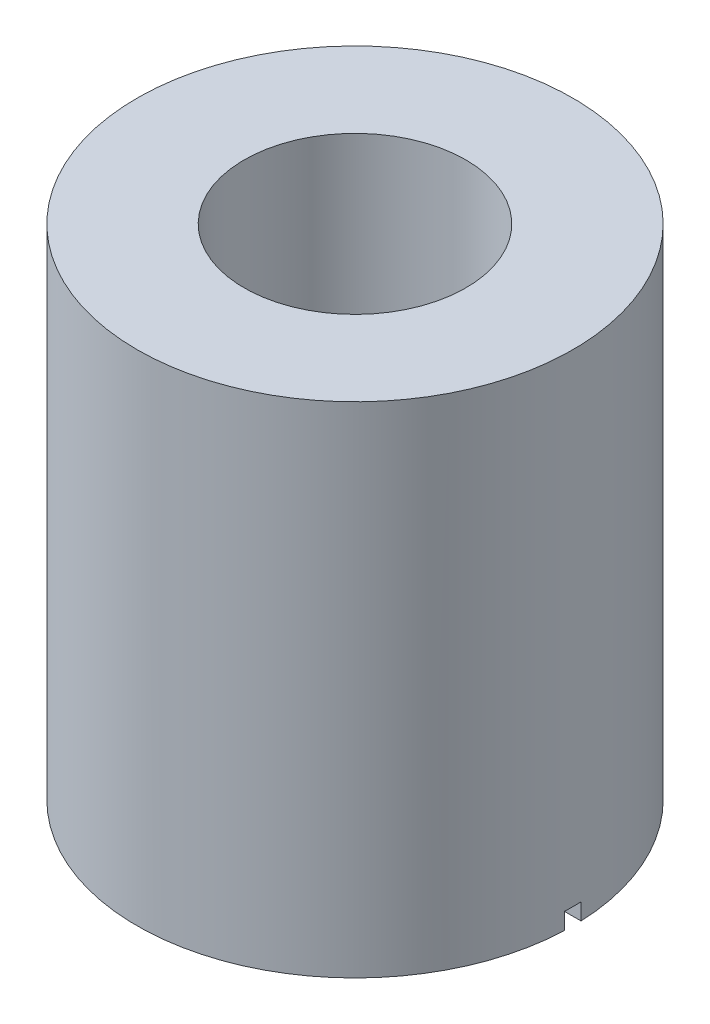
ISO-10303-21;
HEADER;
FILE_DESCRIPTION(('STEP AP214'),'2;1');
FILE_NAME('part.step','',(''),(''),'','','');
FILE_SCHEMA(('AUTOMOTIVE_DESIGN { 1 0 10303 214 1 1 1 1 }'));
ENDSEC;
DATA;
#1=APPLICATION_CONTEXT('core data for automotive mechanical design processes');
#2=APPLICATION_PROTOCOL_DEFINITION('international standard','automotive_design',2000,#1);
#3=PRODUCT_CONTEXT('',#1,'mechanical');
#4=PRODUCT('Part','Part','',(#3));
#5=PRODUCT_RELATED_PRODUCT_CATEGORY('part','',(#4));
#6=PRODUCT_DEFINITION_FORMATION('','',#4);
#7=PRODUCT_DEFINITION_CONTEXT('part definition',#1,'design');
#8=PRODUCT_DEFINITION('design','',#6,#7);
#9=PRODUCT_DEFINITION_SHAPE('','',#8);
#10=(LENGTH_UNIT() NAMED_UNIT(*) SI_UNIT(.MILLI.,.METRE.));
#11=(NAMED_UNIT(*) PLANE_ANGLE_UNIT() SI_UNIT($,.RADIAN.));
#12=(NAMED_UNIT(*) SI_UNIT($,.STERADIAN.) SOLID_ANGLE_UNIT());
#13=UNCERTAINTY_MEASURE_WITH_UNIT(LENGTH_MEASURE(1.E-05),#10,'distance_accuracy_value','');
#14=(GEOMETRIC_REPRESENTATION_CONTEXT(3) GLOBAL_UNCERTAINTY_ASSIGNED_CONTEXT((#13)) GLOBAL_UNIT_ASSIGNED_CONTEXT((#10,
#11,#12)) REPRESENTATION_CONTEXT('',''));
#15=CARTESIAN_POINT('',(0.,0.,0.));
#16=DIRECTION('',(0.,0.,1.));
#17=DIRECTION('',(1.,0.,0.));
#18=AXIS2_PLACEMENT_3D('',#15,#16,#17);
#19=CARTESIAN_POINT('',(0.,0.,0.));
#20=DIRECTION('',(0.,1.,0.));
#21=DIRECTION('',(0.,0.,1.));
#22=AXIS2_PLACEMENT_3D('',#19,#20,#21);
#23=PLANE('',#22);
#24=CARTESIAN_POINT('',(0.,0.,0.));
#25=DIRECTION('',(0.,1.,0.));
#26=DIRECTION('',(0.,0.,1.));
#27=AXIS2_PLACEMENT_3D('',#24,#25,#26);
#28=CIRCLE('',#27,19.65);
#29=CARTESIAN_POINT('',(-19.6356818063443,0.,0.75));
#30=VERTEX_POINT('',#29);
#31=CARTESIAN_POINT('',(19.6356818063443,0.,0.75));
#32=VERTEX_POINT('',#31);
#33=EDGE_CURVE('E128',#30,#32,#28,.T.);
#34=ORIENTED_EDGE('',*,*,#33,.F.);
#35=DIRECTION('',(-1.,0.,0.));
#36=VECTOR('',#35,1.);
#37=CARTESIAN_POINT('',(63.5,0.,0.75));
#38=LINE('',#37,#36);
#39=CARTESIAN_POINT('',(-15.9824122084246,0.,0.75));
#40=VERTEX_POINT('',#39);
#41=EDGE_CURVE('E216',#40,#30,#38,.T.);
#42=ORIENTED_EDGE('',*,*,#41,.F.);
#43=CARTESIAN_POINT('',(0.,0.,0.));
#44=DIRECTION('',(0.,-1.,0.));
#45=DIRECTION('',(0.,0.,-1.));
#46=AXIS2_PLACEMENT_3D('',#43,#44,#45);
#47=CIRCLE('',#46,16.);
#48=CARTESIAN_POINT('',(15.9824122084246,0.,0.75));
#49=VERTEX_POINT('',#48);
#50=EDGE_CURVE('E145',#49,#40,#47,.T.);
#51=ORIENTED_EDGE('',*,*,#50,.F.);
#52=EDGE_CURVE('E200',#32,#49,#38,.T.);
#53=ORIENTED_EDGE('',*,*,#52,.F.);
#54=EDGE_LOOP('',(#34,#42,#51,#53));
#55=FACE_BOUND('',#54,.T.);
#56=ADVANCED_FACE('F38',(#55),#23,.F.);
#57=CARTESIAN_POINT('',(0.,18.,0.));
#58=DIRECTION('',(0.,-1.,0.));
#59=DIRECTION('',(0.,0.,-1.));
#60=AXIS2_PLACEMENT_3D('',#57,#58,#59);
#61=CYLINDRICAL_SURFACE('',#60,0.5);
#62=CARTESIAN_POINT('',(0.,18.,0.));
#63=DIRECTION('',(0.,-1.,0.));
#64=DIRECTION('',(0.,0.,-1.));
#65=AXIS2_PLACEMENT_3D('',#62,#63,#64);
#66=CIRCLE('',#65,0.5);
#67=CARTESIAN_POINT('',(0.,18.,-0.5));
#68=VERTEX_POINT('',#67);
#69=EDGE_CURVE('E149',#68,#68,#66,.T.);
#70=ORIENTED_EDGE('',*,*,#69,.F.);
#71=EDGE_LOOP('',(#70));
#72=FACE_BOUND('',#71,.T.);
#73=CARTESIAN_POINT('',(0.,5.,0.));
#74=DIRECTION('',(0.,-1.,0.));
#75=DIRECTION('',(0.,0.,-1.));
#76=AXIS2_PLACEMENT_3D('',#73,#74,#75);
#77=CIRCLE('',#76,0.5);
#78=CARTESIAN_POINT('',(0.,5.,-0.5));
#79=VERTEX_POINT('',#78);
#80=EDGE_CURVE('E144',#79,#79,#77,.F.);
#81=ORIENTED_EDGE('',*,*,#80,.F.);
#82=EDGE_LOOP('',(#81));
#83=FACE_BOUND('',#82,.T.);
#84=ADVANCED_FACE('F225',(#72,#83),#61,.F.);
#85=CARTESIAN_POINT('',(0.,45.,0.));
#86=DIRECTION('',(0.,-1.,0.));
#87=DIRECTION('',(0.,0.,-1.));
#88=AXIS2_PLACEMENT_3D('',#85,#86,#87);
#89=CYLINDRICAL_SURFACE('',#88,10.);
#90=CARTESIAN_POINT('',(0.,45.,0.));
#91=DIRECTION('',(0.,1.,0.));
#92=DIRECTION('',(0.,0.,1.));
#93=AXIS2_PLACEMENT_3D('',#90,#91,#92);
#94=CIRCLE('',#93,10.);
#95=CARTESIAN_POINT('',(0.,45.,-10.));
#96=VERTEX_POINT('',#95);
#97=EDGE_CURVE('E157',#96,#96,#94,.T.);
#98=CARTESIAN_POINT('',(0.,18.,0.));
#99=DIRECTION('',(0.,-1.,0.));
#100=DIRECTION('',(0.,0.,-1.));
#101=AXIS2_PLACEMENT_3D('',#98,#99,#100);
#102=CIRCLE('',#101,10.);
#103=CARTESIAN_POINT('',(0.,18.,-10.));
#104=VERTEX_POINT('',#103);
#105=EDGE_CURVE('E153',#104,#104,#102,.T.);
#106=CARTESIAN_POINT('',(0.,45.,-10.));
#107=CARTESIAN_POINT('',(0.,44.71875,-10.));
#108=CARTESIAN_POINT('',(0.,44.4375,-10.));
#109=CARTESIAN_POINT('',(0.,43.875,-10.));
#110=CARTESIAN_POINT('',(0.,43.59375,-10.));
#111=CARTESIAN_POINT('',(0.,43.03125,-10.));
#112=CARTESIAN_POINT('',(0.,42.75,-10.));
#113=CARTESIAN_POINT('',(0.,42.1875,-10.));
#114=CARTESIAN_POINT('',(0.,41.90625,-10.));
#115=CARTESIAN_POINT('',(0.,41.34375,-10.));
#116=CARTESIAN_POINT('',(0.,41.0625,-10.));
#117=CARTESIAN_POINT('',(0.,40.5,-10.));
#118=CARTESIAN_POINT('',(0.,40.21875,-10.));
#119=CARTESIAN_POINT('',(0.,39.65625,-10.));
#120=CARTESIAN_POINT('',(0.,39.375,-10.));
#121=CARTESIAN_POINT('',(0.,38.8125,-10.));
#122=CARTESIAN_POINT('',(0.,38.53125,-10.));
#123=CARTESIAN_POINT('',(0.,37.96875,-10.));
#124=CARTESIAN_POINT('',(0.,37.6875,-10.));
#125=CARTESIAN_POINT('',(0.,37.125,-10.));
#126=CARTESIAN_POINT('',(0.,36.84375,-10.));
#127=CARTESIAN_POINT('',(0.,36.28125,-10.));
#128=CARTESIAN_POINT('',(0.,36.,-10.));
#129=CARTESIAN_POINT('',(0.,35.4375,-10.));
#130=CARTESIAN_POINT('',(0.,35.15625,-10.));
#131=CARTESIAN_POINT('',(0.,34.59375,-10.));
#132=CARTESIAN_POINT('',(0.,34.3125,-10.));
#133=CARTESIAN_POINT('',(0.,33.75,-10.));
#134=CARTESIAN_POINT('',(0.,33.46875,-10.));
#135=CARTESIAN_POINT('',(0.,32.90625,-10.));
#136=CARTESIAN_POINT('',(0.,32.625,-10.));
#137=CARTESIAN_POINT('',(0.,32.0625,-10.));
#138=CARTESIAN_POINT('',(0.,31.78125,-10.));
#139=CARTESIAN_POINT('',(0.,31.21875,-10.));
#140=CARTESIAN_POINT('',(0.,30.9375,-10.));
#141=CARTESIAN_POINT('',(0.,30.375,-10.));
#142=CARTESIAN_POINT('',(0.,30.09375,-10.));
#143=CARTESIAN_POINT('',(0.,29.53125,-10.));
#144=CARTESIAN_POINT('',(0.,29.25,-10.));
#145=CARTESIAN_POINT('',(0.,28.6875,-10.));
#146=CARTESIAN_POINT('',(0.,28.40625,-10.));
#147=CARTESIAN_POINT('',(0.,27.84375,-10.));
#148=CARTESIAN_POINT('',(0.,27.5625,-10.));
#149=CARTESIAN_POINT('',(0.,27.,-10.));
#150=CARTESIAN_POINT('',(0.,26.71875,-10.));
#151=CARTESIAN_POINT('',(0.,26.15625,-10.));
#152=CARTESIAN_POINT('',(0.,25.875,-10.));
#153=CARTESIAN_POINT('',(0.,25.3125,-10.));
#154=CARTESIAN_POINT('',(0.,25.03125,-10.));
#155=CARTESIAN_POINT('',(0.,24.46875,-10.));
#156=CARTESIAN_POINT('',(0.,24.1875,-10.));
#157=CARTESIAN_POINT('',(0.,23.625,-10.));
#158=CARTESIAN_POINT('',(0.,23.34375,-10.));
#159=CARTESIAN_POINT('',(0.,22.78125,-10.));
#160=CARTESIAN_POINT('',(0.,22.5,-10.));
#161=CARTESIAN_POINT('',(0.,21.9375,-10.));
#162=CARTESIAN_POINT('',(0.,21.65625,-10.));
#163=CARTESIAN_POINT('',(0.,21.09375,-10.));
#164=CARTESIAN_POINT('',(0.,20.8125,-10.));
#165=CARTESIAN_POINT('',(0.,20.25,-10.));
#166=CARTESIAN_POINT('',(0.,19.96875,-10.));
#167=CARTESIAN_POINT('',(0.,19.40625,-10.));
#168=CARTESIAN_POINT('',(0.,19.125,-10.));
#169=CARTESIAN_POINT('',(0.,18.5625,-10.));
#170=CARTESIAN_POINT('',(0.,18.28125,-10.));
#171=CARTESIAN_POINT('',(0.,18.,-10.));
#172=B_SPLINE_CURVE_WITH_KNOTS('',3,(#106,#107,#108,#109,#110,#111,#112,#113,#114,#115,#116,
#117,#118,#119,#120,#121,#122,#123,#124,#125,#126,#127,#128,#129,#130,#131,#132,#133,#134,#135,
#136,#137,#138,#139,#140,#141,#142,#143,#144,#145,#146,#147,#148,#149,#150,#151,#152,#153,#154,
#155,#156,#157,#158,#159,#160,#161,#162,#163,#164,#165,#166,#167,#168,#169,#170,#171),
.UNSPECIFIED.,.F.,.F.,(4,2,2,2,2,2,2,2,2,2,2,2,2,2,2,2,2,2,2,2,2,2,2,2,2,2,2,2,2,2,2,2,4),(0.,
0.843749999999997,1.68749999999999,2.53125,3.375,4.21874999999999,5.0625,5.90624999999999,6.75,
7.59375,8.43749999999999,9.28125,10.125,10.96875,11.8125,12.65625,13.5,14.34375,15.1875,
16.03125,16.875,17.71875,18.5625,19.40625,20.25,21.09375,21.9375,22.78125,23.625,24.46875,
25.3125,26.15625,27.),.UNSPECIFIED.);
#173=EDGE_CURVE('BSEAM229',#96,#104,#172,.T.);
#174=ORIENTED_EDGE('',*,*,#97,.T.);
#175=ORIENTED_EDGE('',*,*,#105,.T.);
#176=ORIENTED_EDGE('',*,*,#173,.T.);
#177=ORIENTED_EDGE('',*,*,#173,.F.);
#178=EDGE_LOOP('',(#174,#176,#175,#177));
#179=FACE_BOUND('',#178,.T.);
#180=ADVANCED_FACE('F229',(#179),#89,.F.);
#181=CARTESIAN_POINT('',(0.,45.,0.));
#182=DIRECTION('',(0.,1.,0.));
#183=DIRECTION('',(0.,0.,1.));
#184=AXIS2_PLACEMENT_3D('',#181,#182,#183);
#185=PLANE('',#184);
#186=CARTESIAN_POINT('',(0.,45.,0.));
#187=DIRECTION('',(0.,1.,0.));
#188=DIRECTION('',(0.,0.,1.));
#189=AXIS2_PLACEMENT_3D('',#186,#187,#188);
#190=CIRCLE('',#189,19.65);
#191=CARTESIAN_POINT('',(0.,45.,19.65));
#192=VERTEX_POINT('',#191);
#193=EDGE_CURVE('E161',#192,#192,#190,.T.);
#194=ORIENTED_EDGE('',*,*,#193,.T.);
#195=EDGE_LOOP('',(#194));
#196=FACE_BOUND('',#195,.T.);
#197=ORIENTED_EDGE('',*,*,#97,.F.);
#198=EDGE_LOOP('',(#197));
#199=FACE_BOUND('',#198,.T.);
#200=ADVANCED_FACE('F234',(#196,#199),#185,.T.);
#201=CARTESIAN_POINT('',(19.6356818063443,0.,-0.75));
#202=VERTEX_POINT('',#201);
#203=CARTESIAN_POINT('',(-19.6356818063443,0.,-0.75));
#204=VERTEX_POINT('',#203);
#205=EDGE_CURVE('E166',#202,#204,#28,.T.);
#206=ORIENTED_EDGE('',*,*,#205,.F.);
#207=DIRECTION('',(-1.,0.,0.));
#208=VECTOR('',#207,1.);
#209=CARTESIAN_POINT('',(63.5,0.,-0.75));
#210=LINE('',#209,#208);
#211=CARTESIAN_POINT('',(15.9824122084246,0.,-0.75));
#212=VERTEX_POINT('',#211);
#213=EDGE_CURVE('E213',#202,#212,#210,.T.);
#214=ORIENTED_EDGE('',*,*,#213,.T.);
#215=CARTESIAN_POINT('',(-15.9824122084246,0.,-0.75));
#216=VERTEX_POINT('',#215);
#217=EDGE_CURVE('E135',#216,#212,#47,.T.);
#218=ORIENTED_EDGE('',*,*,#217,.F.);
#219=EDGE_CURVE('E208',#216,#204,#210,.T.);
#220=ORIENTED_EDGE('',*,*,#219,.T.);
#221=EDGE_LOOP('',(#206,#214,#218,#220));
#222=FACE_BOUND('',#221,.T.);
#223=ADVANCED_FACE('F210',(#222),#23,.F.);
#224=CARTESIAN_POINT('',(0.,45.,0.));
#225=DIRECTION('',(0.,-1.,0.));
#226=DIRECTION('',(0.,0.,-1.));
#227=AXIS2_PLACEMENT_3D('',#224,#225,#226);
#228=CYLINDRICAL_SURFACE('',#227,19.65);
#229=ORIENTED_EDGE('',*,*,#33,.T.);
#230=DIRECTION('',(0.,-1.,0.));
#231=VECTOR('',#230,1.);
#232=CARTESIAN_POINT('',(19.6356818063443,45.,0.75));
#233=LINE('',#232,#231);
#234=CARTESIAN_POINT('',(19.6356818063443,1.5,0.75));
#235=VERTEX_POINT('',#234);
#236=EDGE_CURVE('E116',#32,#235,#233,.F.);
#237=ORIENTED_EDGE('',*,*,#236,.T.);
#238=CARTESIAN_POINT('',(0.,1.5,0.));
#239=DIRECTION('',(0.,1.,0.));
#240=DIRECTION('',(0.,0.,1.));
#241=AXIS2_PLACEMENT_3D('',#238,#239,#240);
#242=CIRCLE('',#241,19.65);
#243=CARTESIAN_POINT('',(19.6356818063443,1.5,-0.75));
#244=VERTEX_POINT('',#243);
#245=EDGE_CURVE('E103',#235,#244,#242,.T.);
#246=ORIENTED_EDGE('',*,*,#245,.T.);
#247=DIRECTION('',(0.,-1.,0.));
#248=VECTOR('',#247,1.);
#249=CARTESIAN_POINT('',(19.6356818063443,45.,-0.75));
#250=LINE('',#249,#248);
#251=EDGE_CURVE('E131',#244,#202,#250,.T.);
#252=ORIENTED_EDGE('',*,*,#251,.T.);
#253=ORIENTED_EDGE('',*,*,#205,.T.);
#254=DIRECTION('',(0.,-1.,0.));
#255=VECTOR('',#254,1.);
#256=CARTESIAN_POINT('',(-19.6356818063443,45.,-0.75));
#257=LINE('',#256,#255);
#258=CARTESIAN_POINT('',(-19.6356818063443,1.5,-0.75));
#259=VERTEX_POINT('',#258);
#260=EDGE_CURVE('E111',#204,#259,#257,.F.);
#261=ORIENTED_EDGE('',*,*,#260,.T.);
#262=CARTESIAN_POINT('',(-19.6356818063443,1.5,0.75));
#263=VERTEX_POINT('',#262);
#264=EDGE_CURVE('E112',#259,#263,#242,.T.);
#265=ORIENTED_EDGE('',*,*,#264,.T.);
#266=DIRECTION('',(0.,-1.,0.));
#267=VECTOR('',#266,1.);
#268=CARTESIAN_POINT('',(-19.6356818063443,45.,0.75));
#269=LINE('',#268,#267);
#270=EDGE_CURVE('E130',#263,#30,#269,.T.);
#271=ORIENTED_EDGE('',*,*,#270,.T.);
#272=EDGE_LOOP('',(#229,#237,#246,#252,#253,#261,#265,#271));
#273=FACE_BOUND('',#272,.T.);
#274=ORIENTED_EDGE('',*,*,#193,.F.);
#275=EDGE_LOOP('',(#274));
#276=FACE_BOUND('',#275,.T.);
#277=ADVANCED_FACE('F40',(#273,#276),#228,.T.);
#278=CARTESIAN_POINT('',(0.,18.,0.));
#279=DIRECTION('',(0.,-1.,0.));
#280=DIRECTION('',(0.,0.,-1.));
#281=AXIS2_PLACEMENT_3D('',#278,#279,#280);
#282=PLANE('',#281);
#283=ORIENTED_EDGE('',*,*,#69,.T.);
#284=EDGE_LOOP('',(#283));
#285=FACE_BOUND('',#284,.T.);
#286=ORIENTED_EDGE('',*,*,#105,.F.);
#287=EDGE_LOOP('',(#286));
#288=FACE_BOUND('',#287,.T.);
#289=ADVANCED_FACE('F239',(#285,#288),#282,.F.);
#290=CARTESIAN_POINT('',(0.,5.,0.));
#291=DIRECTION('',(0.,-1.,0.));
#292=DIRECTION('',(0.,0.,-1.));
#293=AXIS2_PLACEMENT_3D('',#290,#291,#292);
#294=PLANE('',#293);
#295=CARTESIAN_POINT('',(0.,5.,0.));
#296=DIRECTION('',(0.,-1.,0.));
#297=DIRECTION('',(0.,0.,-1.));
#298=AXIS2_PLACEMENT_3D('',#295,#296,#297);
#299=CIRCLE('',#298,16.);
#300=CARTESIAN_POINT('',(0.,5.,-16.));
#301=VERTEX_POINT('',#300);
#302=EDGE_CURVE('E140',#301,#301,#299,.T.);
#303=ORIENTED_EDGE('',*,*,#302,.T.);
#304=EDGE_LOOP('',(#303));
#305=FACE_BOUND('',#304,.T.);
#306=ORIENTED_EDGE('',*,*,#80,.T.);
#307=EDGE_LOOP('',(#306));
#308=FACE_BOUND('',#307,.T.);
#309=ADVANCED_FACE('F249',(#305,#308),#294,.T.);
#310=CARTESIAN_POINT('',(0.,5.,0.));
#311=DIRECTION('',(0.,-1.,0.));
#312=DIRECTION('',(0.,0.,-1.));
#313=AXIS2_PLACEMENT_3D('',#310,#311,#312);
#314=CYLINDRICAL_SURFACE('',#313,16.);
#315=ORIENTED_EDGE('',*,*,#50,.T.);
#316=DIRECTION('',(0.,-1.,0.));
#317=VECTOR('',#316,1.);
#318=CARTESIAN_POINT('',(-15.9824122084246,5.,0.75));
#319=LINE('',#318,#317);
#320=CARTESIAN_POINT('',(-15.9824122084246,1.5,0.75));
#321=VERTEX_POINT('',#320);
#322=EDGE_CURVE('E11',#40,#321,#319,.F.);
#323=ORIENTED_EDGE('',*,*,#322,.T.);
#324=CARTESIAN_POINT('',(0.,1.5,0.));
#325=DIRECTION('',(0.,1.,0.));
#326=DIRECTION('',(0.,0.,1.));
#327=AXIS2_PLACEMENT_3D('',#324,#325,#326);
#328=CIRCLE('',#327,16.);
#329=CARTESIAN_POINT('',(-15.9824122084246,1.5,-0.75));
#330=VERTEX_POINT('',#329);
#331=EDGE_CURVE('E175',#321,#330,#328,.F.);
#332=ORIENTED_EDGE('',*,*,#331,.T.);
#333=DIRECTION('',(0.,-1.,0.));
#334=VECTOR('',#333,1.);
#335=CARTESIAN_POINT('',(-15.9824122084246,5.,-0.75));
#336=LINE('',#335,#334);
#337=EDGE_CURVE('E47',#330,#216,#336,.T.);
#338=ORIENTED_EDGE('',*,*,#337,.T.);
#339=ORIENTED_EDGE('',*,*,#217,.T.);
#340=DIRECTION('',(0.,-1.,0.));
#341=VECTOR('',#340,1.);
#342=CARTESIAN_POINT('',(15.9824122084246,5.,-0.75));
#343=LINE('',#342,#341);
#344=CARTESIAN_POINT('',(15.9824122084246,1.5,-0.75));
#345=VERTEX_POINT('',#344);
#346=EDGE_CURVE('E174',#212,#345,#343,.F.);
#347=ORIENTED_EDGE('',*,*,#346,.T.);
#348=CARTESIAN_POINT('',(15.9824122084246,1.5,0.75));
#349=VERTEX_POINT('',#348);
#350=EDGE_CURVE('E165',#345,#349,#328,.F.);
#351=ORIENTED_EDGE('',*,*,#350,.T.);
#352=DIRECTION('',(0.,-1.,0.));
#353=VECTOR('',#352,1.);
#354=CARTESIAN_POINT('',(15.9824122084246,5.,0.75));
#355=LINE('',#354,#353);
#356=EDGE_CURVE('E119',#349,#49,#355,.T.);
#357=ORIENTED_EDGE('',*,*,#356,.T.);
#358=EDGE_LOOP('',(#315,#323,#332,#338,#339,#347,#351,#357));
#359=FACE_BOUND('',#358,.T.);
#360=ORIENTED_EDGE('',*,*,#302,.F.);
#361=EDGE_LOOP('',(#360));
#362=FACE_BOUND('',#361,.T.);
#363=ADVANCED_FACE('F187',(#359,#362),#314,.F.);
#364=CARTESIAN_POINT('',(63.5,1.5,0.75));
#365=DIRECTION('',(0.,1.,0.));
#366=DIRECTION('',(0.,0.,1.));
#367=AXIS2_PLACEMENT_3D('',#364,#365,#366);
#368=PLANE('',#367);
#369=DIRECTION('',(-1.,0.,0.));
#370=VECTOR('',#369,1.);
#371=CARTESIAN_POINT('',(63.5,1.5,0.75));
#372=LINE('',#371,#370);
#373=EDGE_CURVE('E62',#235,#349,#372,.T.);
#374=ORIENTED_EDGE('',*,*,#373,.T.);
#375=ORIENTED_EDGE('',*,*,#350,.F.);
#376=DIRECTION('',(-1.,0.,0.));
#377=VECTOR('',#376,1.);
#378=CARTESIAN_POINT('',(63.5,1.5,-0.75));
#379=LINE('',#378,#377);
#380=EDGE_CURVE('E106',#244,#345,#379,.T.);
#381=ORIENTED_EDGE('',*,*,#380,.F.);
#382=ORIENTED_EDGE('',*,*,#245,.F.);
#383=EDGE_LOOP('',(#374,#375,#381,#382));
#384=FACE_BOUND('',#383,.T.);
#385=ADVANCED_FACE('F104',(#384),#368,.F.);
#386=CARTESIAN_POINT('',(63.5,1.5,-0.75));
#387=DIRECTION('',(0.,0.,-1.));
#388=DIRECTION('',(-1.,0.,0.));
#389=AXIS2_PLACEMENT_3D('',#386,#387,#388);
#390=PLANE('',#389);
#391=ORIENTED_EDGE('',*,*,#380,.T.);
#392=ORIENTED_EDGE('',*,*,#346,.F.);
#393=ORIENTED_EDGE('',*,*,#213,.F.);
#394=ORIENTED_EDGE('',*,*,#251,.F.);
#395=EDGE_LOOP('',(#391,#392,#393,#394));
#396=FACE_BOUND('',#395,.T.);
#397=ADVANCED_FACE('F261',(#396),#390,.F.);
#398=CARTESIAN_POINT('',(63.5,1.5,0.75));
#399=DIRECTION('',(0.,0.,1.));
#400=DIRECTION('',(1.,0.,0.));
#401=AXIS2_PLACEMENT_3D('',#398,#399,#400);
#402=PLANE('',#401);
#403=ORIENTED_EDGE('',*,*,#52,.T.);
#404=ORIENTED_EDGE('',*,*,#356,.F.);
#405=ORIENTED_EDGE('',*,*,#373,.F.);
#406=ORIENTED_EDGE('',*,*,#236,.F.);
#407=EDGE_LOOP('',(#403,#404,#405,#406));
#408=FACE_BOUND('',#407,.T.);
#409=ADVANCED_FACE('F115',(#408),#402,.F.);
#410=EDGE_CURVE('E122',#321,#263,#372,.T.);
#411=ORIENTED_EDGE('',*,*,#410,.F.);
#412=ORIENTED_EDGE('',*,*,#322,.F.);
#413=ORIENTED_EDGE('',*,*,#41,.T.);
#414=ORIENTED_EDGE('',*,*,#270,.F.);
#415=EDGE_LOOP('',(#411,#412,#413,#414));
#416=FACE_BOUND('',#415,.T.);
#417=ADVANCED_FACE('F194',(#416),#402,.F.);
#418=ORIENTED_EDGE('',*,*,#219,.F.);
#419=ORIENTED_EDGE('',*,*,#337,.F.);
#420=EDGE_CURVE('E54',#330,#259,#379,.T.);
#421=ORIENTED_EDGE('',*,*,#420,.T.);
#422=ORIENTED_EDGE('',*,*,#260,.F.);
#423=EDGE_LOOP('',(#418,#419,#421,#422));
#424=FACE_BOUND('',#423,.T.);
#425=ADVANCED_FACE('F207',(#424),#390,.F.);
#426=ORIENTED_EDGE('',*,*,#420,.F.);
#427=ORIENTED_EDGE('',*,*,#331,.F.);
#428=ORIENTED_EDGE('',*,*,#410,.T.);
#429=ORIENTED_EDGE('',*,*,#264,.F.);
#430=EDGE_LOOP('',(#426,#427,#428,#429));
#431=FACE_BOUND('',#430,.T.);
#432=ADVANCED_FACE('F191',(#431),#368,.F.);
#433=CLOSED_SHELL('',(#56,#84,#180,#200,#223,#277,#289,#309,#363,#385,#397,#409,#417,#425,#432));
#434=MANIFOLD_SOLID_BREP('B2',#433);
#435=ADVANCED_BREP_SHAPE_REPRESENTATION('',(#18,#434),#14);
#436=SHAPE_DEFINITION_REPRESENTATION(#9,#435);
ENDSEC;
END-ISO-10303-21;
